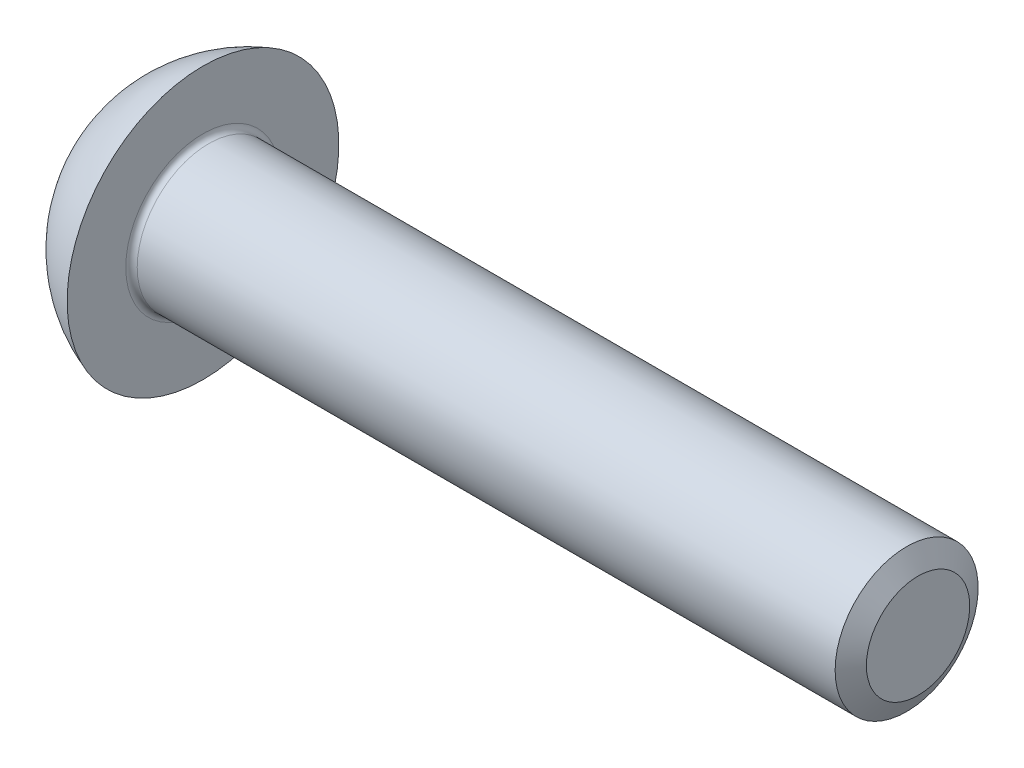
ISO-10303-21;
HEADER;
FILE_DESCRIPTION(('STEP AP214'),'2;1');
FILE_NAME('part.step','',(''),(''),'','','');
FILE_SCHEMA(('AUTOMOTIVE_DESIGN { 1 0 10303 214 1 1 1 1 }'));
ENDSEC;
DATA;
#1=APPLICATION_CONTEXT('core data for automotive mechanical design processes');
#2=APPLICATION_PROTOCOL_DEFINITION('international standard','automotive_design',2000,#1);
#3=PRODUCT_CONTEXT('',#1,'mechanical');
#4=PRODUCT('Part','Part','',(#3));
#5=PRODUCT_RELATED_PRODUCT_CATEGORY('part','',(#4));
#6=PRODUCT_DEFINITION_FORMATION('','',#4);
#7=PRODUCT_DEFINITION_CONTEXT('part definition',#1,'design');
#8=PRODUCT_DEFINITION('design','',#6,#7);
#9=PRODUCT_DEFINITION_SHAPE('','',#8);
#10=(LENGTH_UNIT() NAMED_UNIT(*) SI_UNIT(.MILLI.,.METRE.));
#11=(NAMED_UNIT(*) PLANE_ANGLE_UNIT() SI_UNIT($,.RADIAN.));
#12=(NAMED_UNIT(*) SI_UNIT($,.STERADIAN.) SOLID_ANGLE_UNIT());
#13=UNCERTAINTY_MEASURE_WITH_UNIT(LENGTH_MEASURE(1.E-05),#10,'distance_accuracy_value','');
#14=(GEOMETRIC_REPRESENTATION_CONTEXT(3) GLOBAL_UNCERTAINTY_ASSIGNED_CONTEXT((#13)) GLOBAL_UNIT_ASSIGNED_CONTEXT((#10,
#11,#12)) REPRESENTATION_CONTEXT('',''));
#15=CARTESIAN_POINT('',(0.,0.,0.));
#16=DIRECTION('',(0.,0.,1.));
#17=DIRECTION('',(1.,0.,0.));
#18=AXIS2_PLACEMENT_3D('',#15,#16,#17);
#19=CARTESIAN_POINT('',(-27.75,0.,0.));
#20=DIRECTION('',(-1.,0.,0.));
#21=DIRECTION('',(0.,0.,1.));
#22=AXIS2_PLACEMENT_3D('',#19,#20,#21);
#23=CYLINDRICAL_SURFACE('',#22,2.5);
#24=CARTESIAN_POINT('',(-24.8,0.,0.));
#25=DIRECTION('',(-1.,0.,0.));
#26=DIRECTION('',(0.,0.,1.));
#27=AXIS2_PLACEMENT_3D('',#24,#25,#26);
#28=CIRCLE('',#27,2.5);
#29=CARTESIAN_POINT('',(-24.8,0.,2.5));
#30=VERTEX_POINT('',#29);
#31=EDGE_CURVE('E258',#30,#30,#28,.T.);
#32=ORIENTED_EDGE('',*,*,#31,.F.);
#33=EDGE_LOOP('',(#32));
#34=FACE_BOUND('',#33,.T.);
#35=CARTESIAN_POINT('',(-0.4,0.,0.));
#36=DIRECTION('',(-1.,0.,0.));
#37=DIRECTION('',(0.,0.,1.));
#38=AXIS2_PLACEMENT_3D('',#35,#36,#37);
#39=CIRCLE('',#38,2.5);
#40=CARTESIAN_POINT('',(-0.4,0.,2.5));
#41=VERTEX_POINT('',#40);
#42=EDGE_CURVE('E445',#41,#41,#39,.T.);
#43=ORIENTED_EDGE('',*,*,#42,.T.);
#44=EDGE_LOOP('',(#43));
#45=FACE_BOUND('',#44,.T.);
#46=ADVANCED_FACE('F37',(#34,#45),#23,.T.);
#47=CARTESIAN_POINT('',(-27.75,0.,0.));
#48=DIRECTION('',(1.,0.,0.));
#49=DIRECTION('',(0.,0.,-1.));
#50=AXIS2_PLACEMENT_3D('',#47,#48,#49);
#51=PLANE('',#50);
#52=CARTESIAN_POINT('',(-27.75,0.,0.));
#53=DIRECTION('',(-1.,0.,0.));
#54=DIRECTION('',(0.,0.,1.));
#55=AXIS2_PLACEMENT_3D('',#52,#53,#54);
#56=CIRCLE('',#55,2.5);
#57=CARTESIAN_POINT('',(-27.75,2.50000000000001,0.));
#58=VERTEX_POINT('',#57);
#59=EDGE_CURVE('E250',#58,#58,#56,.T.);
#60=ORIENTED_EDGE('',*,*,#59,.T.);
#61=EDGE_LOOP('',(#60));
#62=FACE_BOUND('',#61,.T.);
#63=CARTESIAN_POINT('',(-27.75,0.,0.));
#64=DIRECTION('',(1.,0.,0.));
#65=DIRECTION('',(0.,0.,-1.));
#66=AXIS2_PLACEMENT_3D('',#63,#64,#65);
#67=CIRCLE('',#66,1.73205080756888);
#68=CARTESIAN_POINT('',(-27.75,-0.866025403784439,-1.5));
#69=VERTEX_POINT('',#68);
#70=CARTESIAN_POINT('',(-27.75,-1.73205080756888,0.));
#71=VERTEX_POINT('',#70);
#72=EDGE_CURVE('E11',#69,#71,#67,.F.);
#73=ORIENTED_EDGE('',*,*,#72,.F.);
#74=CARTESIAN_POINT('',(-27.75,0.866025403784439,-1.5));
#75=VERTEX_POINT('',#74);
#76=EDGE_CURVE('E41',#75,#69,#67,.F.);
#77=ORIENTED_EDGE('',*,*,#76,.F.);
#78=CARTESIAN_POINT('',(-27.75,1.73205080756888,0.));
#79=VERTEX_POINT('',#78);
#80=EDGE_CURVE('E110',#79,#75,#67,.F.);
#81=ORIENTED_EDGE('',*,*,#80,.F.);
#82=CARTESIAN_POINT('',(-27.75,0.866025403784438,1.5));
#83=VERTEX_POINT('',#82);
#84=EDGE_CURVE('E323',#83,#79,#67,.F.);
#85=ORIENTED_EDGE('',*,*,#84,.F.);
#86=CARTESIAN_POINT('',(-27.75,-0.866025403784439,1.5));
#87=VERTEX_POINT('',#86);
#88=EDGE_CURVE('E46',#87,#83,#67,.F.);
#89=ORIENTED_EDGE('',*,*,#88,.F.);
#90=CARTESIAN_POINT('',(-27.75,0.,0.));
#91=DIRECTION('',(-1.,0.,0.));
#92=DIRECTION('',(0.,-1.,0.));
#93=AXIS2_PLACEMENT_3D('',#90,#91,#92);
#94=CIRCLE('',#93,1.73205080756888);
#95=EDGE_CURVE('E113',#71,#87,#94,.T.);
#96=ORIENTED_EDGE('',*,*,#95,.F.);
#97=EDGE_LOOP('',(#73,#77,#81,#85,#89,#96));
#98=FACE_BOUND('',#97,.T.);
#99=ADVANCED_FACE('F39',(#62,#98),#51,.F.);
#100=CARTESIAN_POINT('',(-23.4090909090909,0.,0.));
#101=DIRECTION('',(-1.,0.,0.));
#102=DIRECTION('',(0.,1.,0.));
#103=AXIS2_PLACEMENT_3D('',#100,#101,#102);
#104=SPHERICAL_SURFACE('',#103,5.00934044915468);
#105=CARTESIAN_POINT('',(-25.,0.,0.));
#106=DIRECTION('',(-1.,0.,0.));
#107=DIRECTION('',(0.,0.,1.));
#108=AXIS2_PLACEMENT_3D('',#105,#106,#107);
#109=CIRCLE('',#108,4.75);
#110=CARTESIAN_POINT('',(-25.,4.75,0.));
#111=VERTEX_POINT('',#110);
#112=EDGE_CURVE('E253',#111,#111,#109,.T.);
#113=CARTESIAN_POINT('',(-27.75,2.50000000000001,0.));
#114=CARTESIAN_POINT('',(-27.7311175552492,2.53278694875914,0.));
#115=CARTESIAN_POINT('',(-27.7118635180392,2.56535988781073,0.));
#116=CARTESIAN_POINT('',(-27.6726224406993,2.63006120326841,0.));
#117=CARTESIAN_POINT('',(-27.6526354005692,2.66218957967448,0.));
#118=CARTESIAN_POINT('',(-27.6119384993871,2.72598522661067,0.));
#119=CARTESIAN_POINT('',(-27.591228638335,2.75765249714078,0.));
#120=CARTESIAN_POINT('',(-27.5490967492469,2.82050968698786,0.));
#121=CARTESIAN_POINT('',(-27.5276747212109,2.85169960630483,0.));
#122=CARTESIAN_POINT('',(-27.4841294907069,2.9135860770778,0.));
#123=CARTESIAN_POINT('',(-27.4620062882389,2.94428262853379,0.));
#124=CARTESIAN_POINT('',(-27.4170700686518,3.00516660462735,0.));
#125=CARTESIAN_POINT('',(-27.3942570515327,3.03535402926492,0.));
#126=CARTESIAN_POINT('',(-27.3479529146413,3.09520425297794,0.));
#127=CARTESIAN_POINT('',(-27.3244617948691,3.12486705205339,0.));
#128=CARTESIAN_POINT('',(-27.2768135133334,3.1836527955612,0.));
#129=CARTESIAN_POINT('',(-27.2526563515699,3.21277573999357,0.));
#130=CARTESIAN_POINT('',(-27.2036883885261,3.27046682221599,0.));
#131=CARTESIAN_POINT('',(-27.1788775872458,3.29903496000605,0.));
#132=CARTESIAN_POINT('',(-27.1286150832646,3.35560176181,0.));
#133=CARTESIAN_POINT('',(-27.1031633805637,3.38360042582389,0.));
#134=CARTESIAN_POINT('',(-27.0516321408722,3.43901390530852,0.));
#135=CARTESIAN_POINT('',(-27.0255526038815,3.46642872077927,0.));
#136=CARTESIAN_POINT('',(-26.9727790850795,3.52066042816535,0.));
#137=CARTESIAN_POINT('',(-26.9460851032681,3.54747732008068,0.));
#138=CARTESIAN_POINT('',(-26.8920963997549,3.60049941232258,0.));
#139=CARTESIAN_POINT('',(-26.8648016780529,3.62670461264913,0.));
#140=CARTESIAN_POINT('',(-26.8096255081138,3.67848986772817,0.));
#141=CARTESIAN_POINT('',(-26.7817440598766,3.70406992248065,0.));
#142=CARTESIAN_POINT('',(-26.7254087514531,3.75459175338155,0.));
#143=CARTESIAN_POINT('',(-26.6969548912667,3.77953352952998,0.));
#144=CARTESIAN_POINT('',(-26.6394893674124,3.82876599789079,0.));
#145=CARTESIAN_POINT('',(-26.6104777037444,3.85305669010317,0.));
#146=CARTESIAN_POINT('',(-26.5519114677755,3.90097451953224,0.));
#147=CARTESIAN_POINT('',(-26.5223568954747,3.92460165674892,0.));
#148=CARTESIAN_POINT('',(-26.4627200158231,3.97118024580204,0.));
#149=CARTESIAN_POINT('',(-26.4326377084724,3.99413169763847,0.));
#150=CARTESIAN_POINT('',(-26.371960803248,4.03934713244946,0.));
#151=CARTESIAN_POINT('',(-26.3413662053744,4.06161111542403,0.));
#152=CARTESIAN_POINT('',(-26.2796804266456,4.10544018198238,0.));
#153=CARTESIAN_POINT('',(-26.2485892457905,4.12700526556617,0.));
#154=CARTESIAN_POINT('',(-26.1859262635903,4.16942546163525,0.));
#155=CARTESIAN_POINT('',(-26.1543544622453,4.19028057412053,0.));
#156=CARTESIAN_POINT('',(-26.0907464483121,4.2312701207906,0.));
#157=CARTESIAN_POINT('',(-26.0587102357238,4.25140455497539,0.));
#158=CARTESIAN_POINT('',(-25.9941898469831,4.29094240784443,0.));
#159=CARTESIAN_POINT('',(-25.9617056708307,4.31034582652867,0.));
#160=CARTESIAN_POINT('',(-25.8963060326305,4.34841168650943,0.));
#161=CARTESIAN_POINT('',(-25.8633905705828,4.36707412780594,0.));
#162=CARTESIAN_POINT('',(-25.7971452596828,4.4036484515375,0.));
#163=CARTESIAN_POINT('',(-25.7638154108306,4.42156033397254,0.));
#164=CARTESIAN_POINT('',(-25.6967584381773,4.45662434389216,0.));
#165=CARTESIAN_POINT('',(-25.6630313143761,4.47377647137673,0.));
#166=CARTESIAN_POINT('',(-25.5951971075898,4.50731216521815,0.));
#167=CARTESIAN_POINT('',(-25.5610900246047,4.52369573157501,0.));
#168=CARTESIAN_POINT('',(-25.4925134104957,4.55568589214188,0.));
#169=CARTESIAN_POINT('',(-25.4580438793719,4.5712924863519,0.));
#170=CARTESIAN_POINT('',(-25.3887600653461,4.60172068837599,0.));
#171=CARTESIAN_POINT('',(-25.3539457824442,4.61654229619007,0.));
#172=CARTESIAN_POINT('',(-25.2839903410915,4.64539292215818,0.));
#173=CARTESIAN_POINT('',(-25.2488491826407,4.65942194031221,0.));
#174=CARTESIAN_POINT('',(-25.1782580235286,4.68668016088954,0.));
#175=CARTESIAN_POINT('',(-25.1428080228672,4.69990936331284,0.));
#176=CARTESIAN_POINT('',(-25.0716174112126,4.72556124794158,0.));
#177=CARTESIAN_POINT('',(-25.0358768002195,4.73798393014703,0.));
#178=CARTESIAN_POINT('',(-25.,4.75,0.));
#179=B_SPLINE_CURVE_WITH_KNOTS('',3,(#113,#114,#115,#116,#117,#118,#119,#120,#121,#122,#123,
#124,#125,#126,#127,#128,#129,#130,#131,#132,#133,#134,#135,#136,#137,#138,#139,#140,#141,#142,
#143,#144,#145,#146,#147,#148,#149,#150,#151,#152,#153,#154,#155,#156,#157,#158,#159,#160,#161,
#162,#163,#164,#165,#166,#167,#168,#169,#170,#171,#172,#173,#174,#175,#176,#177,#178),
.UNSPECIFIED.,.F.,.F.,(4,2,2,2,2,2,2,2,2,2,2,2,2,2,2,2,2,2,2,2,2,2,2,2,2,2,2,2,2,2,2,2,4),(0.,
0.113504291292348,0.227008582584698,0.340512873877048,0.454017165169397,0.567521456461745,
0.681025747754093,0.794530039046444,0.908034330338791,1.02153862163114,1.13504291292349,
1.24854720421584,1.36205149550819,1.47555578680054,1.58906007809289,1.70256436938524,
1.81606866067759,1.92957295196994,2.04307724326228,2.15658153455463,2.27008582584698,
2.38359011713933,2.49709440843168,2.61059869972403,2.72410299101638,2.83760728230873,
2.95111157360107,3.06461586489343,3.17812015618577,3.29162444747812,3.40512873877047,
3.51863303006282,3.63213732135517),.UNSPECIFIED.);
#180=EDGE_CURVE('BSEAM239',#58,#111,#179,.T.);
#181=ORIENTED_EDGE('',*,*,#59,.F.);
#182=ORIENTED_EDGE('',*,*,#112,.T.);
#183=ORIENTED_EDGE('',*,*,#180,.T.);
#184=ORIENTED_EDGE('',*,*,#180,.F.);
#185=EDGE_LOOP('',(#181,#183,#182,#184));
#186=FACE_BOUND('',#185,.T.);
#187=ADVANCED_FACE('F239',(#186),#104,.T.);
#188=CARTESIAN_POINT('',(-25.,2.7,0.));
#189=DIRECTION('',(-1.,0.,0.));
#190=DIRECTION('',(0.,0.,1.));
#191=AXIS2_PLACEMENT_3D('',#188,#189,#190);
#192=PLANE('',#191);
#193=ORIENTED_EDGE('',*,*,#112,.F.);
#194=EDGE_LOOP('',(#193));
#195=FACE_BOUND('',#194,.T.);
#196=CARTESIAN_POINT('',(-25.,0.,0.));
#197=DIRECTION('',(-1.,0.,0.));
#198=DIRECTION('',(0.,0.,1.));
#199=AXIS2_PLACEMENT_3D('',#196,#197,#198);
#200=CIRCLE('',#199,2.7);
#201=CARTESIAN_POINT('',(-25.,0.,2.7));
#202=VERTEX_POINT('',#201);
#203=EDGE_CURVE('E254',#202,#202,#200,.T.);
#204=ORIENTED_EDGE('',*,*,#203,.T.);
#205=EDGE_LOOP('',(#204));
#206=FACE_BOUND('',#205,.T.);
#207=ADVANCED_FACE('F236',(#195,#206),#192,.F.);
#208=CARTESIAN_POINT('',(-24.8,0.,0.));
#209=DIRECTION('',(-1.,0.,0.));
#210=DIRECTION('',(0.,0.,1.));
#211=AXIS2_PLACEMENT_3D('',#208,#209,#210);
#212=TOROIDAL_SURFACE('',#211,2.7,0.199999999999999);
#213=ORIENTED_EDGE('',*,*,#203,.F.);
#214=EDGE_LOOP('',(#213));
#215=FACE_BOUND('',#214,.T.);
#216=ORIENTED_EDGE('',*,*,#31,.T.);
#217=EDGE_LOOP('',(#216));
#218=FACE_BOUND('',#217,.T.);
#219=ADVANCED_FACE('F233',(#215,#218),#212,.F.);
#220=CARTESIAN_POINT('',(-27.31,0.,0.));
#221=DIRECTION('',(-1.,0.,0.));
#222=DIRECTION('',(0.,-1.,0.));
#223=AXIS2_PLACEMENT_3D('',#220,#221,#222);
#224=CONICAL_SURFACE('',#223,0.,1.32202446504011);
#225=CARTESIAN_POINT('',(-27.9997327986404,-2.26315484172187,-1.5));
#226=CARTESIAN_POINT('',(-27.9853857350657,-2.19538826304415,-1.5));
#227=CARTESIAN_POINT('',(-27.9712220195062,-2.12758283804671,-1.5));
#228=CARTESIAN_POINT('',(-27.9433537036584,-1.99187493960313,-1.5));
#229=CARTESIAN_POINT('',(-27.9296491220636,-1.92397246232262,-1.5));
#230=CARTESIAN_POINT('',(-27.8893400794674,-1.71997534200334,-1.5));
#231=CARTESIAN_POINT('',(-27.8635667005034,-1.58371395303,-1.5));
#232=CARTESIAN_POINT('',(-27.8155779533991,-1.3116391722774,-1.5));
#233=CARTESIAN_POINT('',(-27.793336642225,-1.17583044881344,-1.5));
#234=CARTESIAN_POINT('',(-27.7539239714673,-0.903481186888281,-1.5));
#235=CARTESIAN_POINT('',(-27.7367516962328,-0.766940785137059,-1.5));
#236=CARTESIAN_POINT('',(-27.709706129123,-0.491701196322738,-1.5));
#237=CARTESIAN_POINT('',(-27.6999076664801,-0.352994084625562,-1.5));
#238=CARTESIAN_POINT('',(-27.6924178089428,-0.144706433475353,-1.5));
#239=CARTESIAN_POINT('',(-27.6911221806896,-0.0752488922868261,-1.5));
#240=CARTESIAN_POINT('',(-27.6909858523406,0.0636686770369293,-1.5));
#241=CARTESIAN_POINT('',(-27.6921451546032,0.133128705174483,-1.5));
#242=CARTESIAN_POINT('',(-27.6992549405331,0.341881937640923,-1.5));
#243=CARTESIAN_POINT('',(-27.7088546722717,0.481057921169192,-1.5));
#244=CARTESIAN_POINT('',(-27.7357583960435,0.758693846093777,-1.5));
#245=CARTESIAN_POINT('',(-27.7530672903777,0.897153275062592,-1.5));
#246=CARTESIAN_POINT('',(-27.7932968062946,1.17595805857205,-1.5));
#247=CARTESIAN_POINT('',(-27.8163192995754,1.31628822780093,-1.5));
#248=CARTESIAN_POINT('',(-27.8658765091574,1.59633374824372,-1.5));
#249=CARTESIAN_POINT('',(-27.8924117291953,1.73604900830286,-1.5));
#250=CARTESIAN_POINT('',(-27.9477673387906,2.01506024311157,-1.5));
#251=CARTESIAN_POINT('',(-27.9765883427125,2.15435609462068,-1.5));
#252=CARTESIAN_POINT('',(-28.0357503424025,2.43262525968748,-1.5));
#253=CARTESIAN_POINT('',(-28.0660913684414,2.57159856676409,-1.5));
#254=CARTESIAN_POINT('',(-28.1274868354949,2.84781730595657,-1.5));
#255=CARTESIAN_POINT('',(-28.1585300832572,2.9850652362243,-1.5));
#256=CARTESIAN_POINT('',(-28.2213470846916,3.25939633410717,-1.5));
#257=CARTESIAN_POINT('',(-28.2531208531965,3.3964794983173,-1.5));
#258=CARTESIAN_POINT('',(-28.3171602523357,3.67034628769396,-1.5));
#259=CARTESIAN_POINT('',(-28.3494252041408,3.80713007192237,-1.5));
#260=CARTESIAN_POINT('',(-28.4143613419051,4.08059651515644,-1.5));
#261=CARTESIAN_POINT('',(-28.4470325145344,4.2172791773253,-1.5));
#262=CARTESIAN_POINT('',(-28.4798452974435,4.35392744466994,-1.5));
#263=B_SPLINE_CURVE_WITH_KNOTS('',3,(#225,#226,#227,#228,#229,#230,#231,#232,#233,#234,#235,
#236,#237,#238,#239,#240,#241,#242,#243,#244,#245,#246,#247,#248,#249,#250,#251,#252,#253,#254,
#255,#256,#257,#258,#259,#260,#261,#262),.UNSPECIFIED.,.F.,.F.,(4,2,2,2,2,2,2,2,2,2,2,2,2,2,2,2,
2,2,4),(0.,0.207805451429303,0.415619353325522,0.831624344388975,1.24441629689243,
1.65713363858961,2.07398475112846,2.2823533704914,2.49072219003519,2.90892839515078,
3.32740092054575,3.75395104515456,4.18056240487916,4.60728881874959,5.03402373410526,
5.45616570257761,5.87831624988613,6.2999285163862,6.7215269840495),.UNSPECIFIED.);
#264=EDGE_CURVE('E101',#69,#75,#263,.T.);
#265=ORIENTED_EDGE('',*,*,#264,.T.);
#266=ORIENTED_EDGE('',*,*,#76,.T.);
#267=EDGE_LOOP('',(#265,#266));
#268=FACE_BOUND('',#267,.T.);
#269=ADVANCED_FACE('F105',(#268),#224,.F.);
#270=CARTESIAN_POINT('',(-27.7500293362665,0.865909933730601,-1.5002));
#271=CARTESIAN_POINT('',(-27.74088246153,0.901895428599615,-1.43787129455136));
#272=CARTESIAN_POINT('',(-27.7325805371761,0.937939683086652,-1.37544081445887));
#273=CARTESIAN_POINT('',(-27.7179971360444,1.01014267536443,-1.25038156337525));
#274=CARTESIAN_POINT('',(-27.7117163935223,1.04630144995174,-1.18775272865061));
#275=CARTESIAN_POINT('',(-27.7015367196182,1.11853617159982,-1.06263852068553));
#276=CARTESIAN_POINT('',(-27.6976268615435,1.15461172337414,-1.00015383210133));
#277=CARTESIAN_POINT('',(-27.6923843134507,1.22680422415262,-0.875112752827542));
#278=CARTESIAN_POINT('',(-27.6910511776652,1.26292116491464,-0.812556376413771));
#279=CARTESIAN_POINT('',(-27.6910511776652,1.33515504643868,-0.687443623586229));
#280=CARTESIAN_POINT('',(-27.6923843134507,1.37127198720069,-0.624887247172458));
#281=CARTESIAN_POINT('',(-27.6976268615435,1.44346448797918,-0.499846167898673));
#282=CARTESIAN_POINT('',(-27.7015367196182,1.47954003975349,-0.437361479314471));
#283=CARTESIAN_POINT('',(-27.7117163935223,1.55177476140158,-0.312247271349392));
#284=CARTESIAN_POINT('',(-27.7179971360444,1.58793353598888,-0.249618436624751));
#285=CARTESIAN_POINT('',(-27.7325805371761,1.66013652826666,-0.124559185541131));
#286=CARTESIAN_POINT('',(-27.74088246153,1.6961807827537,-0.0621287054486417));
#287=CARTESIAN_POINT('',(-27.7500293362665,1.73216627762272,0.000199999999999961));
#288=B_SPLINE_CURVE_WITH_KNOTS('',3,(#270,#271,#272,#273,#274,#275,#276,#277,#278,#279,#280,
#281,#282,#283,#284,#285,#286,#287),.UNSPECIFIED.,.F.,.F.,(4,2,2,2,2,2,2,2,4),(0.,
0.217659888175594,0.435398758882079,0.652126354970008,0.868816454295957,1.08550655362191,
1.30223414970984,1.51997302041632,1.73763290859191),.UNSPECIFIED.);
#289=EDGE_CURVE('E129',#75,#79,#288,.T.);
#290=ORIENTED_EDGE('',*,*,#289,.T.);
#291=ORIENTED_EDGE('',*,*,#80,.T.);
#292=EDGE_LOOP('',(#290,#291));
#293=FACE_BOUND('',#292,.T.);
#294=ADVANCED_FACE('F157',(#293),#224,.F.);
#295=CARTESIAN_POINT('',(-27.7500293362665,1.73216627762271,-0.000200000000000225));
#296=CARTESIAN_POINT('',(-27.74088246153,1.6961807827537,0.0621287054486414));
#297=CARTESIAN_POINT('',(-27.7325805371761,1.66013652826666,0.124559185541131));
#298=CARTESIAN_POINT('',(-27.7179971360444,1.58793353598888,0.249618436624751));
#299=CARTESIAN_POINT('',(-27.7117163935223,1.55177476140158,0.312247271349392));
#300=CARTESIAN_POINT('',(-27.7015367196182,1.47954003975349,0.437361479314471));
#301=CARTESIAN_POINT('',(-27.6976268615435,1.44346448797918,0.499846167898673));
#302=CARTESIAN_POINT('',(-27.6923843134507,1.37127198720069,0.624887247172458));
#303=CARTESIAN_POINT('',(-27.6910511776652,1.33515504643868,0.687443623586229));
#304=CARTESIAN_POINT('',(-27.6910511776652,1.26292116491464,0.812556376413771));
#305=CARTESIAN_POINT('',(-27.6923843134507,1.22680422415262,0.875112752827542));
#306=CARTESIAN_POINT('',(-27.6976268615435,1.15461172337414,1.00015383210133));
#307=CARTESIAN_POINT('',(-27.7015367196182,1.11853617159982,1.06263852068553));
#308=CARTESIAN_POINT('',(-27.7117163935223,1.04630144995174,1.18775272865061));
#309=CARTESIAN_POINT('',(-27.7179971360444,1.01014267536443,1.25038156337525));
#310=CARTESIAN_POINT('',(-27.7325805371761,0.937939683086651,1.37544081445887));
#311=CARTESIAN_POINT('',(-27.74088246153,0.901895428599615,1.43787129455136));
#312=CARTESIAN_POINT('',(-27.7500293362665,0.865909933730601,1.5002));
#313=B_SPLINE_CURVE_WITH_KNOTS('',3,(#295,#296,#297,#298,#299,#300,#301,#302,#303,#304,#305,
#306,#307,#308,#309,#310,#311,#312),.UNSPECIFIED.,.F.,.F.,(4,2,2,2,2,2,2,2,4),(0.,
0.217659888175594,0.435398758882079,0.652126354970008,0.868816454295957,1.08550655362191,
1.30223414970984,1.51997302041632,1.73763290859191),.UNSPECIFIED.);
#314=EDGE_CURVE('E179',#79,#83,#313,.T.);
#315=ORIENTED_EDGE('',*,*,#314,.T.);
#316=ORIENTED_EDGE('',*,*,#84,.T.);
#317=EDGE_LOOP('',(#315,#316));
#318=FACE_BOUND('',#317,.T.);
#319=ADVANCED_FACE('F151',(#318),#224,.F.);
#320=CARTESIAN_POINT('',(-27.9997327986404,-2.26315484172187,1.5));
#321=CARTESIAN_POINT('',(-27.9853857350657,-2.19538826304415,1.5));
#322=CARTESIAN_POINT('',(-27.9712220195062,-2.12758283804671,1.5));
#323=CARTESIAN_POINT('',(-27.9433537036584,-1.99187493960313,1.5));
#324=CARTESIAN_POINT('',(-27.9296491220636,-1.92397246232262,1.5));
#325=CARTESIAN_POINT('',(-27.8893400794674,-1.71997534200334,1.5));
#326=CARTESIAN_POINT('',(-27.8635667005034,-1.58371395303,1.5));
#327=CARTESIAN_POINT('',(-27.8155779533991,-1.3116391722774,1.5));
#328=CARTESIAN_POINT('',(-27.793336642225,-1.17583044881344,1.5));
#329=CARTESIAN_POINT('',(-27.7539239714673,-0.903481186888281,1.5));
#330=CARTESIAN_POINT('',(-27.7367516962328,-0.766940785137059,1.5));
#331=CARTESIAN_POINT('',(-27.709706129123,-0.491701196322739,1.5));
#332=CARTESIAN_POINT('',(-27.6999076664801,-0.352994084625562,1.5));
#333=CARTESIAN_POINT('',(-27.6924178089428,-0.144706433475353,1.5));
#334=CARTESIAN_POINT('',(-27.6911221806896,-0.0752488922868266,1.5));
#335=CARTESIAN_POINT('',(-27.6909858523406,0.0636686770369288,1.5));
#336=CARTESIAN_POINT('',(-27.6921451546032,0.133128705174483,1.5));
#337=CARTESIAN_POINT('',(-27.6992549405331,0.341881937640923,1.5));
#338=CARTESIAN_POINT('',(-27.7088546722717,0.481057921169192,1.5));
#339=CARTESIAN_POINT('',(-27.7357583960435,0.758693846093777,1.5));
#340=CARTESIAN_POINT('',(-27.7530672903777,0.897153275062592,1.5));
#341=CARTESIAN_POINT('',(-27.7932968062946,1.17595805857205,1.5));
#342=CARTESIAN_POINT('',(-27.8163192995754,1.31628822780093,1.5));
#343=CARTESIAN_POINT('',(-27.8658765091574,1.59633374824372,1.5));
#344=CARTESIAN_POINT('',(-27.8924117291953,1.73604900830286,1.5));
#345=CARTESIAN_POINT('',(-27.9477673387906,2.01506024311157,1.5));
#346=CARTESIAN_POINT('',(-27.9765883427125,2.15435609462068,1.5));
#347=CARTESIAN_POINT('',(-28.0357503424025,2.43262525968748,1.5));
#348=CARTESIAN_POINT('',(-28.0660913684414,2.57159856676409,1.5));
#349=CARTESIAN_POINT('',(-28.1274868354949,2.84781730595657,1.5));
#350=CARTESIAN_POINT('',(-28.1585300832572,2.9850652362243,1.5));
#351=CARTESIAN_POINT('',(-28.2213470846916,3.25939633410717,1.5));
#352=CARTESIAN_POINT('',(-28.2531208531965,3.3964794983173,1.5));
#353=CARTESIAN_POINT('',(-28.3171602523357,3.67034628769396,1.5));
#354=CARTESIAN_POINT('',(-28.3494252041408,3.80713007192237,1.5));
#355=CARTESIAN_POINT('',(-28.4143613419051,4.08059651515644,1.5));
#356=CARTESIAN_POINT('',(-28.4470325145344,4.2172791773253,1.5));
#357=CARTESIAN_POINT('',(-28.4798452974435,4.35392744466994,1.5));
#358=B_SPLINE_CURVE_WITH_KNOTS('',3,(#320,#321,#322,#323,#324,#325,#326,#327,#328,#329,#330,
#331,#332,#333,#334,#335,#336,#337,#338,#339,#340,#341,#342,#343,#344,#345,#346,#347,#348,#349,
#350,#351,#352,#353,#354,#355,#356,#357),.UNSPECIFIED.,.F.,.F.,(4,2,2,2,2,2,2,2,2,2,2,2,2,2,2,2,
2,2,4),(0.,0.207805451429303,0.415619353325523,0.831624344388975,1.24441629689243,
1.65713363858961,2.07398475112846,2.2823533704914,2.49072219003519,2.90892839515078,
3.32740092054575,3.75395104515456,4.18056240487916,4.60728881874959,5.03402373410526,
5.45616570257761,5.87831624988613,6.2999285163862,6.7215269840495),.UNSPECIFIED.);
#359=EDGE_CURVE('E58',#83,#87,#358,.F.);
#360=ORIENTED_EDGE('',*,*,#359,.T.);
#361=ORIENTED_EDGE('',*,*,#88,.T.);
#362=EDGE_LOOP('',(#360,#361));
#363=FACE_BOUND('',#362,.T.);
#364=ADVANCED_FACE('F156',(#363),#224,.F.);
#365=CARTESIAN_POINT('',(-27.7500293362665,-0.865909933730602,1.5002));
#366=CARTESIAN_POINT('',(-27.74088246153,-0.901895428599616,1.43787129455136));
#367=CARTESIAN_POINT('',(-27.7325805371761,-0.937939683086652,1.37544081445887));
#368=CARTESIAN_POINT('',(-27.7179971360444,-1.01014267536443,1.25038156337525));
#369=CARTESIAN_POINT('',(-27.7117163935223,-1.04630144995174,1.18775272865061));
#370=CARTESIAN_POINT('',(-27.7015367196182,-1.11853617159982,1.06263852068553));
#371=CARTESIAN_POINT('',(-27.6976268615435,-1.15461172337414,1.00015383210133));
#372=CARTESIAN_POINT('',(-27.6923843134507,-1.22680422415262,0.875112752827542));
#373=CARTESIAN_POINT('',(-27.6910511776652,-1.26292116491464,0.812556376413771));
#374=CARTESIAN_POINT('',(-27.6910511776652,-1.33515504643868,0.687443623586229));
#375=CARTESIAN_POINT('',(-27.6923843134507,-1.3712719872007,0.624887247172458));
#376=CARTESIAN_POINT('',(-27.6976268615435,-1.44346448797918,0.499846167898673));
#377=CARTESIAN_POINT('',(-27.7015367196182,-1.4795400397535,0.437361479314471));
#378=CARTESIAN_POINT('',(-27.7117163935223,-1.55177476140158,0.312247271349392));
#379=CARTESIAN_POINT('',(-27.7179971360444,-1.58793353598888,0.249618436624751));
#380=CARTESIAN_POINT('',(-27.7325805371761,-1.66013652826667,0.124559185541131));
#381=CARTESIAN_POINT('',(-27.74088246153,-1.6961807827537,0.0621287054486417));
#382=CARTESIAN_POINT('',(-27.7500293362665,-1.73216627762272,-0.000200000000000103));
#383=B_SPLINE_CURVE_WITH_KNOTS('',3,(#365,#366,#367,#368,#369,#370,#371,#372,#373,#374,#375,
#376,#377,#378,#379,#380,#381,#382),.UNSPECIFIED.,.F.,.F.,(4,2,2,2,2,2,2,2,4),(0.,
0.217659888175594,0.435398758882078,0.652126354970008,0.868816454295957,1.08550655362191,
1.30223414970984,1.51997302041632,1.73763290859191),.UNSPECIFIED.);
#384=EDGE_CURVE('E52',#87,#71,#383,.T.);
#385=ORIENTED_EDGE('',*,*,#384,.T.);
#386=ORIENTED_EDGE('',*,*,#95,.T.);
#387=EDGE_LOOP('',(#385,#386));
#388=FACE_BOUND('',#387,.T.);
#389=ADVANCED_FACE('F310',(#388),#224,.F.);
#390=CARTESIAN_POINT('',(-27.7500293362665,-1.73216627762272,0.00019999999999925));
#391=CARTESIAN_POINT('',(-27.74088246153,-1.6961807827537,-0.0621287054486427));
#392=CARTESIAN_POINT('',(-27.7325805371761,-1.66013652826667,-0.124559185541132));
#393=CARTESIAN_POINT('',(-27.7179971360444,-1.58793353598888,-0.249618436624752));
#394=CARTESIAN_POINT('',(-27.7117163935223,-1.55177476140158,-0.312247271349392));
#395=CARTESIAN_POINT('',(-27.7015367196182,-1.4795400397535,-0.437361479314472));
#396=CARTESIAN_POINT('',(-27.6976268615435,-1.44346448797918,-0.499846167898674));
#397=CARTESIAN_POINT('',(-27.6923843134507,-1.3712719872007,-0.624887247172459));
#398=CARTESIAN_POINT('',(-27.6910511776652,-1.33515504643868,-0.687443623586229));
#399=CARTESIAN_POINT('',(-27.6910511776652,-1.26292116491464,-0.812556376413771));
#400=CARTESIAN_POINT('',(-27.6923843134507,-1.22680422415262,-0.875112752827542));
#401=CARTESIAN_POINT('',(-27.6976268615435,-1.15461172337414,-1.00015383210133));
#402=CARTESIAN_POINT('',(-27.7015367196182,-1.11853617159982,-1.06263852068553));
#403=CARTESIAN_POINT('',(-27.7117163935223,-1.04630144995174,-1.18775272865061));
#404=CARTESIAN_POINT('',(-27.7179971360444,-1.01014267536443,-1.25038156337525));
#405=CARTESIAN_POINT('',(-27.7325805371761,-0.937939683086652,-1.37544081445887));
#406=CARTESIAN_POINT('',(-27.74088246153,-0.901895428599616,-1.43787129455136));
#407=CARTESIAN_POINT('',(-27.7500293362665,-0.865909933730602,-1.5002));
#408=B_SPLINE_CURVE_WITH_KNOTS('',3,(#390,#391,#392,#393,#394,#395,#396,#397,#398,#399,#400,
#401,#402,#403,#404,#405,#406,#407),.UNSPECIFIED.,.F.,.F.,(4,2,2,2,2,2,2,2,4),(0.,
0.217659888175594,0.435398758882078,0.652126354970008,0.868816454295957,1.08550655362191,
1.30223414970983,1.51997302041632,1.73763290859191),.UNSPECIFIED.);
#409=EDGE_CURVE('E93',#71,#69,#408,.T.);
#410=ORIENTED_EDGE('',*,*,#409,.T.);
#411=ORIENTED_EDGE('',*,*,#72,.T.);
#412=EDGE_LOOP('',(#410,#411));
#413=FACE_BOUND('',#412,.T.);
#414=ADVANCED_FACE('F95',(#413),#224,.F.);
#415=CARTESIAN_POINT('',(-26.19,0.,0.));
#416=DIRECTION('',(-1.,0.,0.));
#417=DIRECTION('',(0.,0.,1.));
#418=AXIS2_PLACEMENT_3D('',#415,#416,#417);
#419=CONICAL_SURFACE('',#418,1.73205080756888,0.9688167751957);
#420=CARTESIAN_POINT('',(-25.,0.,0.));
#421=VERTEX_POINT('',#420);
#422=VERTEX_LOOP('',#421);
#423=FACE_BOUND('',#422,.T.);
#424=CARTESIAN_POINT('',(-26.7143652871569,-1.99408064313991,1.5));
#425=CARTESIAN_POINT('',(-26.684227855331,-1.93917647330948,1.5));
#426=CARTESIAN_POINT('',(-26.6544233144778,-1.88408663074089,1.5));
#427=CARTESIAN_POINT('',(-26.5956475088077,-1.77344983083036,1.5));
#428=CARTESIAN_POINT('',(-26.5666764212646,-1.71790277942533,1.5));
#429=CARTESIAN_POINT('',(-26.509567028683,-1.60593431975272,1.5));
#430=CARTESIAN_POINT('',(-26.4814351847783,-1.54950959844382,1.5));
#431=CARTESIAN_POINT('',(-26.4264488202439,-1.43604611919069,1.5));
#432=CARTESIAN_POINT('',(-26.399594226521,-1.37900739661351,1.5));
#433=CARTESIAN_POINT('',(-26.3197775837943,-1.2033156155846,1.5));
#434=CARTESIAN_POINT('',(-26.2693416399369,-1.08349045754164,1.5));
#435=CARTESIAN_POINT('',(-26.1790949619613,-0.8400581944788,1.5));
#436=CARTESIAN_POINT('',(-26.139256444983,-0.716461944664997,1.5));
#437=CARTESIAN_POINT('',(-26.0902439408571,-0.521743313216658,1.5));
#438=CARTESIAN_POINT('',(-26.0753421174822,-0.45207993269385,1.5));
#439=CARTESIAN_POINT('',(-26.0515518141555,-0.311717383105093,1.5));
#440=CARTESIAN_POINT('',(-26.0426622801891,-0.241018397812503,1.5));
#441=CARTESIAN_POINT('',(-26.0317604291188,-0.10011099678774,1.5));
#442=CARTESIAN_POINT('',(-26.0296501098018,-0.0299103680159297,1.5));
#443=CARTESIAN_POINT('',(-26.0322315011996,0.110369362468126,1.5));
#444=CARTESIAN_POINT('',(-26.0369241805432,0.180448445451887,1.5));
#445=CARTESIAN_POINT('',(-26.0544804827323,0.335771456747223,1.5));
#446=CARTESIAN_POINT('',(-26.0689629761538,0.420830424976738,1.5));
#447=CARTESIAN_POINT('',(-26.1058580296261,0.589196026048479,1.5));
#448=CARTESIAN_POINT('',(-26.1282753745263,0.672501569361891,1.5));
#449=CARTESIAN_POINT('',(-26.1797644805511,0.839227656420879,1.5));
#450=CARTESIAN_POINT('',(-26.208985606932,0.922601164698547,1.5));
#451=CARTESIAN_POINT('',(-26.2562928043733,1.04629218365326,1.5));
#452=CARTESIAN_POINT('',(-26.272640267702,1.0872924127348,1.5));
#453=CARTESIAN_POINT('',(-26.3063320836918,1.16888024651751,1.5));
#454=CARTESIAN_POINT('',(-26.3236763971299,1.20946786737972,1.5));
#455=CARTESIAN_POINT('',(-26.3779952738762,1.33298038355504,1.5));
#456=CARTESIAN_POINT('',(-26.4163386174147,1.41530297926866,1.5));
#457=CARTESIAN_POINT('',(-26.495635756582,1.57868674687711,1.5));
#458=CARTESIAN_POINT('',(-26.5365900776787,1.65974766074442,1.5));
#459=CARTESIAN_POINT('',(-26.6204609314907,1.82090931341637,1.5));
#460=CARTESIAN_POINT('',(-26.6633786931538,1.90100941012621,1.5));
#461=CARTESIAN_POINT('',(-26.7506848855457,2.06040592965211,1.5));
#462=CARTESIAN_POINT('',(-26.7950733934288,2.13970231002002,1.5));
#463=CARTESIAN_POINT('',(-26.930164519251,2.37707005979971,1.5));
#464=CARTESIAN_POINT('',(-27.0225574046205,2.53417780353515,1.5));
#465=CARTESIAN_POINT('',(-27.2100828976953,2.84665345203122,1.5));
#466=CARTESIAN_POINT('',(-27.3052144606998,3.00202198962762,1.5));
#467=CARTESIAN_POINT('',(-27.4847567141849,3.29134301760585,1.5));
#468=CARTESIAN_POINT('',(-27.5689406054582,3.42543652219581,1.5));
#469=CARTESIAN_POINT('',(-27.7383361071422,3.69299221027437,1.5));
#470=CARTESIAN_POINT('',(-27.8235478291718,3.82645432296446,1.5));
#471=CARTESIAN_POINT('',(-27.9942515824776,4.09214637193531,1.5));
#472=CARTESIAN_POINT('',(-28.0797393883462,4.22437902653419,1.5));
#473=CARTESIAN_POINT('',(-28.2512890449572,4.48844643440619,1.5));
#474=CARTESIAN_POINT('',(-28.337350817286,4.6202812385973,1.5));
#475=CARTESIAN_POINT('',(-28.4236230682157,4.75197710942023,1.5));
#476=B_SPLINE_CURVE_WITH_KNOTS('',3,(#424,#425,#426,#427,#428,#429,#430,#431,#432,#433,#434,
#435,#436,#437,#438,#439,#440,#441,#442,#443,#444,#445,#446,#447,#448,#449,#450,#451,#452,#453,
#454,#455,#456,#457,#458,#459,#460,#461,#462,#463,#464,#465,#466,#467,#468,#469,#470,#471,#472,
#473,#474,#475),.UNSPECIFIED.,.F.,.F.,(4,2,2,2,2,2,2,2,2,2,2,2,2,2,2,2,2,2,2,2,2,2,2,2,2,4),(0.,
0.187897672724946,0.375835019809246,0.564966516875882,0.754087177468065,1.14383628374048,
1.53255329837711,1.74605704440216,1.95952335136655,2.16988950807789,2.38028562021645,
2.63864645394486,2.89716334978482,3.16200405007931,3.29441189873303,3.42681454110392,
3.69918602540152,3.97161249945486,4.24421188688914,4.51682559737459,5.06355522456946,
5.61007898891364,6.08505893344604,6.5600909321466,7.03246913033172,7.50478406427736),.UNSPECIFIED.);
#477=CARTESIAN_POINT('',(-26.19,-0.86602540378444,1.5));
#478=VERTEX_POINT('',#477);
#479=CARTESIAN_POINT('',(-26.19,0.866025403784438,1.5));
#480=VERTEX_POINT('',#479);
#481=EDGE_CURVE('E195',#478,#480,#476,.T.);
#482=ORIENTED_EDGE('',*,*,#481,.T.);
#483=CARTESIAN_POINT('',(-26.1900793412661,0.865909933730601,1.5002));
#484=CARTESIAN_POINT('',(-26.1634691060163,0.904628108595007,1.43313815395851));
#485=CARTESIAN_POINT('',(-26.1392096198792,0.943819339495374,1.36525695082791));
#486=CARTESIAN_POINT('',(-26.0969184478749,1.02317811595439,1.2278035179744));
#487=CARTESIAN_POINT('',(-26.0789101024377,1.06334873364809,1.15822596715748));
#488=CARTESIAN_POINT('',(-26.051360884505,1.14298393177099,1.02029375793781));
#489=CARTESIAN_POINT('',(-26.041544608846,1.18242369147111,0.951982090298889));
#490=CARTESIAN_POINT('',(-26.0304461987689,1.2615373932253,0.814953139285775));
#491=CARTESIAN_POINT('',(-26.0291476300534,1.30121073639966,0.746236893201675));
#492=CARTESIAN_POINT('',(-26.034672374901,1.37365810646578,0.62075436737241));
#493=CARTESIAN_POINT('',(-26.0401544132113,1.40646009894811,0.563939649803516));
#494=CARTESIAN_POINT('',(-26.0566235391784,1.47175617463545,0.450843529178185));
#495=CARTESIAN_POINT('',(-26.0676180560889,1.50424978184483,0.394562950570361));
#496=CARTESIAN_POINT('',(-26.0947645558192,1.56971224903147,0.281178631414286));
#497=CARTESIAN_POINT('',(-26.1110632959916,1.6026654835586,0.224101954939563));
#498=CARTESIAN_POINT('',(-26.1477413089342,1.66790213243921,0.111108764562816));
#499=CARTESIAN_POINT('',(-26.1681087683375,1.70018719405561,0.0551893975177125));
#500=CARTESIAN_POINT('',(-26.1900793412661,1.73216627762271,-0.000200000000000001));
#501=B_SPLINE_CURVE_WITH_KNOTS('',3,(#483,#484,#485,#486,#487,#488,#489,#490,#491,#492,#493,
#494,#495,#496,#497,#498,#499,#500),.UNSPECIFIED.,.F.,.F.,(4,2,2,2,2,2,2,2,4),(0.,
0.245805375632315,0.49251890592962,0.730559729160707,0.968141134459948,1.16539297017392,
1.36291136273929,1.56644008251059,1.76938623584072),.UNSPECIFIED.);
#502=CARTESIAN_POINT('',(-26.19,1.73205080756888,0.));
#503=VERTEX_POINT('',#502);
#504=EDGE_CURVE('E203',#480,#503,#501,.T.);
#505=ORIENTED_EDGE('',*,*,#504,.T.);
#506=CARTESIAN_POINT('',(-26.1900793412661,1.73216627762271,0.000199999999999775));
#507=CARTESIAN_POINT('',(-26.1634691060163,1.69344810275831,-0.0668618460414889));
#508=CARTESIAN_POINT('',(-26.1392096198792,1.65425687185794,-0.134743049172087));
#509=CARTESIAN_POINT('',(-26.0969184478749,1.57489809539893,-0.272196482025596));
#510=CARTESIAN_POINT('',(-26.0789101024377,1.53472747770523,-0.341774032842517));
#511=CARTESIAN_POINT('',(-26.051360884505,1.45509227958233,-0.479706242062188));
#512=CARTESIAN_POINT('',(-26.041544608846,1.4156525198822,-0.548017909701111));
#513=CARTESIAN_POINT('',(-26.0304461987689,1.33653881812801,-0.685046860714225));
#514=CARTESIAN_POINT('',(-26.0291476300534,1.29686547495366,-0.753763106798325));
#515=CARTESIAN_POINT('',(-26.034672374901,1.22441810488754,-0.879245632627591));
#516=CARTESIAN_POINT('',(-26.0401544132113,1.1916161124052,-0.936060350196485));
#517=CARTESIAN_POINT('',(-26.0566235391784,1.12632003671786,-1.04915647082182));
#518=CARTESIAN_POINT('',(-26.0676180560889,1.09382642950849,-1.10543704942964));
#519=CARTESIAN_POINT('',(-26.0947645558192,1.02836396232185,-1.21882136858571));
#520=CARTESIAN_POINT('',(-26.1110632959916,0.995410727794717,-1.27589804506044));
#521=CARTESIAN_POINT('',(-26.1477413089342,0.930174078914108,-1.38889123543718));
#522=CARTESIAN_POINT('',(-26.1681087683375,0.897889017297704,-1.44481060248229));
#523=CARTESIAN_POINT('',(-26.1900793412661,0.865909933730601,-1.5002));
#524=B_SPLINE_CURVE_WITH_KNOTS('',3,(#506,#507,#508,#509,#510,#511,#512,#513,#514,#515,#516,
#517,#518,#519,#520,#521,#522,#523),.UNSPECIFIED.,.F.,.F.,(4,2,2,2,2,2,2,2,4),(0.,
0.245805375632315,0.492518905929621,0.730559729160707,0.968141134459949,1.16539297017392,
1.36291136273929,1.56644008251059,1.76938623584072),.UNSPECIFIED.);
#525=CARTESIAN_POINT('',(-26.19,0.86602540378444,-1.5));
#526=VERTEX_POINT('',#525);
#527=EDGE_CURVE('E111',#503,#526,#524,.T.);
#528=ORIENTED_EDGE('',*,*,#527,.T.);
#529=CARTESIAN_POINT('',(-26.7143652871569,-1.99408064313991,-1.5));
#530=CARTESIAN_POINT('',(-26.684227855331,-1.93917647330948,-1.5));
#531=CARTESIAN_POINT('',(-26.6544233144778,-1.88408663074089,-1.5));
#532=CARTESIAN_POINT('',(-26.5956475088077,-1.77344983083036,-1.5));
#533=CARTESIAN_POINT('',(-26.5666764212646,-1.71790277942533,-1.5));
#534=CARTESIAN_POINT('',(-26.509567028683,-1.60593431975272,-1.5));
#535=CARTESIAN_POINT('',(-26.4814351847783,-1.54950959844382,-1.5));
#536=CARTESIAN_POINT('',(-26.4264488202439,-1.43604611919069,-1.5));
#537=CARTESIAN_POINT('',(-26.399594226521,-1.37900739661351,-1.5));
#538=CARTESIAN_POINT('',(-26.3197775837943,-1.2033156155846,-1.5));
#539=CARTESIAN_POINT('',(-26.2693416399369,-1.08349045754164,-1.5));
#540=CARTESIAN_POINT('',(-26.1790949619613,-0.8400581944788,-1.5));
#541=CARTESIAN_POINT('',(-26.139256444983,-0.716461944664997,-1.5));
#542=CARTESIAN_POINT('',(-26.0902439408571,-0.521743313216658,-1.5));
#543=CARTESIAN_POINT('',(-26.0753421174822,-0.45207993269385,-1.5));
#544=CARTESIAN_POINT('',(-26.0515518141555,-0.311717383105093,-1.5));
#545=CARTESIAN_POINT('',(-26.0426622801891,-0.241018397812503,-1.5));
#546=CARTESIAN_POINT('',(-26.0317604291188,-0.10011099678774,-1.5));
#547=CARTESIAN_POINT('',(-26.0296501098018,-0.0299103680159296,-1.5));
#548=CARTESIAN_POINT('',(-26.0322315011996,0.110369362468126,-1.5));
#549=CARTESIAN_POINT('',(-26.0369241805432,0.180448445451887,-1.5));
#550=CARTESIAN_POINT('',(-26.0544804827323,0.335771456747223,-1.5));
#551=CARTESIAN_POINT('',(-26.0689629761538,0.420830424976738,-1.5));
#552=CARTESIAN_POINT('',(-26.1058580296261,0.58919602604848,-1.5));
#553=CARTESIAN_POINT('',(-26.1282753745263,0.672501569361891,-1.5));
#554=CARTESIAN_POINT('',(-26.1797644805511,0.839227656420879,-1.5));
#555=CARTESIAN_POINT('',(-26.208985606932,0.922601164698547,-1.5));
#556=CARTESIAN_POINT('',(-26.2562928043733,1.04629218365326,-1.5));
#557=CARTESIAN_POINT('',(-26.272640267702,1.0872924127348,-1.5));
#558=CARTESIAN_POINT('',(-26.3063320836918,1.16888024651751,-1.5));
#559=CARTESIAN_POINT('',(-26.3236763971299,1.20946786737972,-1.5));
#560=CARTESIAN_POINT('',(-26.3779952738762,1.33298038355504,-1.5));
#561=CARTESIAN_POINT('',(-26.4163386174147,1.41530297926866,-1.5));
#562=CARTESIAN_POINT('',(-26.495635756582,1.57868674687711,-1.5));
#563=CARTESIAN_POINT('',(-26.5365900776787,1.65974766074442,-1.5));
#564=CARTESIAN_POINT('',(-26.6204609314907,1.82090931341637,-1.5));
#565=CARTESIAN_POINT('',(-26.6633786931538,1.90100941012621,-1.5));
#566=CARTESIAN_POINT('',(-26.7506848855457,2.06040592965211,-1.5));
#567=CARTESIAN_POINT('',(-26.7950733934288,2.13970231002002,-1.5));
#568=CARTESIAN_POINT('',(-26.930164519251,2.37707005979971,-1.5));
#569=CARTESIAN_POINT('',(-27.0225574046205,2.53417780353515,-1.5));
#570=CARTESIAN_POINT('',(-27.2100828976953,2.84665345203122,-1.5));
#571=CARTESIAN_POINT('',(-27.3052144606998,3.00202198962762,-1.5));
#572=CARTESIAN_POINT('',(-27.4847567141849,3.29134301760585,-1.5));
#573=CARTESIAN_POINT('',(-27.5689406054582,3.42543652219581,-1.5));
#574=CARTESIAN_POINT('',(-27.7383361071422,3.69299221027437,-1.5));
#575=CARTESIAN_POINT('',(-27.8235478291718,3.82645432296446,-1.5));
#576=CARTESIAN_POINT('',(-27.9942515824776,4.09214637193531,-1.5));
#577=CARTESIAN_POINT('',(-28.0797393883462,4.22437902653419,-1.5));
#578=CARTESIAN_POINT('',(-28.2512890449572,4.48844643440619,-1.5));
#579=CARTESIAN_POINT('',(-28.337350817286,4.6202812385973,-1.5));
#580=CARTESIAN_POINT('',(-28.4236230682157,4.75197710942023,-1.5));
#581=B_SPLINE_CURVE_WITH_KNOTS('',3,(#529,#530,#531,#532,#533,#534,#535,#536,#537,#538,#539,
#540,#541,#542,#543,#544,#545,#546,#547,#548,#549,#550,#551,#552,#553,#554,#555,#556,#557,#558,
#559,#560,#561,#562,#563,#564,#565,#566,#567,#568,#569,#570,#571,#572,#573,#574,#575,#576,#577,
#578,#579,#580),.UNSPECIFIED.,.F.,.F.,(4,2,2,2,2,2,2,2,2,2,2,2,2,2,2,2,2,2,2,2,2,2,2,2,2,4),(0.,
0.187897672724946,0.375835019809246,0.564966516875882,0.754087177468065,1.14383628374048,
1.53255329837711,1.74605704440216,1.95952335136655,2.16988950807789,2.38028562021645,
2.63864645394486,2.89716334978482,3.16200405007931,3.29441189873303,3.42681454110392,
3.69918602540152,3.97161249945486,4.24421188688914,4.51682559737459,5.06355522456946,
5.61007898891364,6.08505893344604,6.5600909321466,7.03246913033172,7.50478406427736),.UNSPECIFIED.);
#582=CARTESIAN_POINT('',(-26.19,-0.866025403784439,-1.5));
#583=VERTEX_POINT('',#582);
#584=EDGE_CURVE('E267',#526,#583,#581,.F.);
#585=ORIENTED_EDGE('',*,*,#584,.T.);
#586=CARTESIAN_POINT('',(-26.1900793412661,-0.865909933730602,-1.5002));
#587=CARTESIAN_POINT('',(-26.1634691060163,-0.904628108595008,-1.43313815395851));
#588=CARTESIAN_POINT('',(-26.1392096198791,-0.943819339495374,-1.36525695082791));
#589=CARTESIAN_POINT('',(-26.0969184478749,-1.02317811595439,-1.2278035179744));
#590=CARTESIAN_POINT('',(-26.0789101024377,-1.06334873364809,-1.15822596715748));
#591=CARTESIAN_POINT('',(-26.051360884505,-1.14298393177099,-1.02029375793781));
#592=CARTESIAN_POINT('',(-26.041544608846,-1.18242369147111,-0.951982090298889));
#593=CARTESIAN_POINT('',(-26.0304461987689,-1.26153739322531,-0.814953139285776));
#594=CARTESIAN_POINT('',(-26.0291476300534,-1.30121073639966,-0.746236893201675));
#595=CARTESIAN_POINT('',(-26.034672374901,-1.37365810646578,-0.62075436737241));
#596=CARTESIAN_POINT('',(-26.0401544132113,-1.40646009894812,-0.563939649803516));
#597=CARTESIAN_POINT('',(-26.0566235391784,-1.47175617463545,-0.450843529178184));
#598=CARTESIAN_POINT('',(-26.0676180560889,-1.50424978184483,-0.394562950570361));
#599=CARTESIAN_POINT('',(-26.0947645558192,-1.56971224903147,-0.281178631414285));
#600=CARTESIAN_POINT('',(-26.1110632959916,-1.6026654835586,-0.224101954939563));
#601=CARTESIAN_POINT('',(-26.1477413089342,-1.66790213243921,-0.111108764562816));
#602=CARTESIAN_POINT('',(-26.1681087683375,-1.70018719405561,-0.0551893975177126));
#603=CARTESIAN_POINT('',(-26.1900793412661,-1.73216627762272,0.000199999999999747));
#604=B_SPLINE_CURVE_WITH_KNOTS('',3,(#586,#587,#588,#589,#590,#591,#592,#593,#594,#595,#596,
#597,#598,#599,#600,#601,#602,#603),.UNSPECIFIED.,.F.,.F.,(4,2,2,2,2,2,2,2,4),(0.,
0.245805375632315,0.49251890592962,0.730559729160706,0.968141134459948,1.16539297017392,
1.36291136273929,1.56644008251059,1.76938623584072),.UNSPECIFIED.);
#605=CARTESIAN_POINT('',(-26.19,-1.73205080756888,0.));
#606=VERTEX_POINT('',#605);
#607=EDGE_CURVE('E119',#583,#606,#604,.T.);
#608=ORIENTED_EDGE('',*,*,#607,.T.);
#609=CARTESIAN_POINT('',(-26.1900793412661,-1.73216627762272,-0.000200000000001143));
#610=CARTESIAN_POINT('',(-26.1634691060163,-1.69344810275831,0.0668618460414866));
#611=CARTESIAN_POINT('',(-26.1392096198791,-1.65425687185794,0.134743049172084));
#612=CARTESIAN_POINT('',(-26.0969184478749,-1.57489809539893,0.272196482025595));
#613=CARTESIAN_POINT('',(-26.0789101024377,-1.53472747770523,0.341774032842517));
#614=CARTESIAN_POINT('',(-26.051360884505,-1.45509227958233,0.479706242062188));
#615=CARTESIAN_POINT('',(-26.041544608846,-1.41565251988221,0.548017909701111));
#616=CARTESIAN_POINT('',(-26.0304461987689,-1.33653881812801,0.685046860714225));
#617=CARTESIAN_POINT('',(-26.0291476300534,-1.29686547495366,0.753763106798325));
#618=CARTESIAN_POINT('',(-26.034672374901,-1.22441810488754,0.87924563262759));
#619=CARTESIAN_POINT('',(-26.0401544132113,-1.1916161124052,0.936060350196484));
#620=CARTESIAN_POINT('',(-26.0566235391784,-1.12632003671787,1.04915647082181));
#621=CARTESIAN_POINT('',(-26.0676180560889,-1.09382642950849,1.10543704942964));
#622=CARTESIAN_POINT('',(-26.0947645558192,-1.02836396232185,1.21882136858571));
#623=CARTESIAN_POINT('',(-26.1110632959916,-0.995410727794719,1.27589804506044));
#624=CARTESIAN_POINT('',(-26.1477413089342,-0.93017407891411,1.38889123543718));
#625=CARTESIAN_POINT('',(-26.1681087683375,-0.897889017297705,1.44481060248229));
#626=CARTESIAN_POINT('',(-26.1900793412661,-0.865909933730602,1.5002));
#627=B_SPLINE_CURVE_WITH_KNOTS('',3,(#609,#610,#611,#612,#613,#614,#615,#616,#617,#618,#619,
#620,#621,#622,#623,#624,#625,#626),.UNSPECIFIED.,.F.,.F.,(4,2,2,2,2,2,2,2,4),(0.,
0.245805375632316,0.492518905929622,0.730559729160709,0.968141134459951,1.16539297017392,
1.36291136273929,1.56644008251059,1.76938623584073),.UNSPECIFIED.);
#628=EDGE_CURVE('E204',#606,#478,#627,.T.);
#629=ORIENTED_EDGE('',*,*,#628,.T.);
#630=EDGE_LOOP('',(#482,#505,#528,#585,#608,#629));
#631=FACE_BOUND('',#630,.T.);
#632=ADVANCED_FACE('F160',(#423,#631),#419,.F.);
#633=CARTESIAN_POINT('',(-25.,1.73205080756888,0.));
#634=DIRECTION('',(0.,0.866025403784439,-0.5));
#635=DIRECTION('',(0.,0.5,0.866025403784439));
#636=AXIS2_PLACEMENT_3D('',#633,#634,#635);
#637=PLANE('',#636);
#638=ORIENTED_EDGE('',*,*,#289,.F.);
#639=DIRECTION('',(-1.,0.,0.));
#640=VECTOR('',#639,1.);
#641=CARTESIAN_POINT('',(-25.,0.866025403784439,-1.5));
#642=LINE('',#641,#640);
#643=EDGE_CURVE('E124',#526,#75,#642,.T.);
#644=ORIENTED_EDGE('',*,*,#643,.F.);
#645=ORIENTED_EDGE('',*,*,#527,.F.);
#646=DIRECTION('',(-1.,0.,0.));
#647=VECTOR('',#646,1.);
#648=CARTESIAN_POINT('',(-25.,1.73205080756888,0.));
#649=LINE('',#648,#647);
#650=EDGE_CURVE('E216',#503,#79,#649,.T.);
#651=ORIENTED_EDGE('',*,*,#650,.T.);
#652=EDGE_LOOP('',(#638,#644,#645,#651));
#653=FACE_BOUND('',#652,.T.);
#654=ADVANCED_FACE('F223',(#653),#637,.F.);
#655=CARTESIAN_POINT('',(-25.,0.866025403784439,-1.5));
#656=DIRECTION('',(0.,0.,-1.));
#657=DIRECTION('',(-1.,0.,0.));
#658=AXIS2_PLACEMENT_3D('',#655,#656,#657);
#659=PLANE('',#658);
#660=ORIENTED_EDGE('',*,*,#264,.F.);
#661=DIRECTION('',(-1.,0.,0.));
#662=VECTOR('',#661,1.);
#663=CARTESIAN_POINT('',(-25.,-0.866025403784439,-1.5));
#664=LINE('',#663,#662);
#665=EDGE_CURVE('E116',#583,#69,#664,.T.);
#666=ORIENTED_EDGE('',*,*,#665,.F.);
#667=ORIENTED_EDGE('',*,*,#584,.F.);
#668=ORIENTED_EDGE('',*,*,#643,.T.);
#669=EDGE_LOOP('',(#660,#666,#667,#668));
#670=FACE_BOUND('',#669,.T.);
#671=ADVANCED_FACE('F127',(#670),#659,.F.);
#672=CARTESIAN_POINT('',(-25.,-0.866025403784439,-1.5));
#673=DIRECTION('',(0.,-0.866025403784439,-0.5));
#674=DIRECTION('',(0.,0.5,-0.866025403784439));
#675=AXIS2_PLACEMENT_3D('',#672,#673,#674);
#676=PLANE('',#675);
#677=ORIENTED_EDGE('',*,*,#409,.F.);
#678=DIRECTION('',(-1.,0.,0.));
#679=VECTOR('',#678,1.);
#680=CARTESIAN_POINT('',(-25.,-1.73205080756888,0.));
#681=LINE('',#680,#679);
#682=EDGE_CURVE('E123',#606,#71,#681,.T.);
#683=ORIENTED_EDGE('',*,*,#682,.F.);
#684=ORIENTED_EDGE('',*,*,#607,.F.);
#685=ORIENTED_EDGE('',*,*,#665,.T.);
#686=EDGE_LOOP('',(#677,#683,#684,#685));
#687=FACE_BOUND('',#686,.T.);
#688=ADVANCED_FACE('F117',(#687),#676,.F.);
#689=CARTESIAN_POINT('',(-25.,-1.73205080756888,0.));
#690=DIRECTION('',(0.,-0.866025403784439,0.5));
#691=DIRECTION('',(0.,-0.5,-0.866025403784439));
#692=AXIS2_PLACEMENT_3D('',#689,#690,#691);
#693=PLANE('',#692);
#694=ORIENTED_EDGE('',*,*,#384,.F.);
#695=DIRECTION('',(-1.,0.,0.));
#696=VECTOR('',#695,1.);
#697=CARTESIAN_POINT('',(-25.,-0.86602540378444,1.5));
#698=LINE('',#697,#696);
#699=EDGE_CURVE('E279',#478,#87,#698,.T.);
#700=ORIENTED_EDGE('',*,*,#699,.F.);
#701=ORIENTED_EDGE('',*,*,#628,.F.);
#702=ORIENTED_EDGE('',*,*,#682,.T.);
#703=EDGE_LOOP('',(#694,#700,#701,#702));
#704=FACE_BOUND('',#703,.T.);
#705=ADVANCED_FACE('F190',(#704),#693,.F.);
#706=CARTESIAN_POINT('',(-25.,-0.86602540378444,1.5));
#707=DIRECTION('',(0.,0.,1.));
#708=DIRECTION('',(1.,0.,0.));
#709=AXIS2_PLACEMENT_3D('',#706,#707,#708);
#710=PLANE('',#709);
#711=ORIENTED_EDGE('',*,*,#359,.F.);
#712=DIRECTION('',(-1.,0.,0.));
#713=VECTOR('',#712,1.);
#714=CARTESIAN_POINT('',(-25.,0.866025403784438,1.5));
#715=LINE('',#714,#713);
#716=EDGE_CURVE('E217',#480,#83,#715,.T.);
#717=ORIENTED_EDGE('',*,*,#716,.F.);
#718=ORIENTED_EDGE('',*,*,#481,.F.);
#719=ORIENTED_EDGE('',*,*,#699,.T.);
#720=EDGE_LOOP('',(#711,#717,#718,#719));
#721=FACE_BOUND('',#720,.T.);
#722=ADVANCED_FACE('F186',(#721),#710,.F.);
#723=CARTESIAN_POINT('',(-25.,0.866025403784438,1.5));
#724=DIRECTION('',(0.,0.866025403784439,0.5));
#725=DIRECTION('',(0.,-0.5,0.866025403784439));
#726=AXIS2_PLACEMENT_3D('',#723,#724,#725);
#727=PLANE('',#726);
#728=ORIENTED_EDGE('',*,*,#314,.F.);
#729=ORIENTED_EDGE('',*,*,#650,.F.);
#730=ORIENTED_EDGE('',*,*,#504,.F.);
#731=ORIENTED_EDGE('',*,*,#716,.T.);
#732=EDGE_LOOP('',(#728,#729,#730,#731));
#733=FACE_BOUND('',#732,.T.);
#734=ADVANCED_FACE('F189',(#733),#727,.F.);
#735=CARTESIAN_POINT('',(-0.4,0.,0.));
#736=DIRECTION('',(-1.,0.,0.));
#737=DIRECTION('',(0.,0.,1.));
#738=AXIS2_PLACEMENT_3D('',#735,#736,#737);
#739=CONICAL_SURFACE('',#738,2.5,1.0471975511966);
#740=CARTESIAN_POINT('',(0.,0.,0.));
#741=DIRECTION('',(-1.,0.,0.));
#742=DIRECTION('',(0.,0.,1.));
#743=AXIS2_PLACEMENT_3D('',#740,#741,#742);
#744=CIRCLE('',#743,1.80717967697245);
#745=CARTESIAN_POINT('',(0.,0.,1.80717967697245));
#746=VERTEX_POINT('',#745);
#747=EDGE_CURVE('E442',#746,#746,#744,.T.);
#748=ORIENTED_EDGE('',*,*,#747,.T.);
#749=EDGE_LOOP('',(#748));
#750=FACE_BOUND('',#749,.T.);
#751=ORIENTED_EDGE('',*,*,#42,.F.);
#752=EDGE_LOOP('',(#751));
#753=FACE_BOUND('',#752,.T.);
#754=ADVANCED_FACE('F159',(#750,#753),#739,.T.);
#755=CARTESIAN_POINT('',(0.,2.5,0.));
#756=DIRECTION('',(-1.,0.,0.));
#757=DIRECTION('',(0.,0.,1.));
#758=AXIS2_PLACEMENT_3D('',#755,#756,#757);
#759=PLANE('',#758);
#760=ORIENTED_EDGE('',*,*,#747,.F.);
#761=EDGE_LOOP('',(#760));
#762=FACE_BOUND('',#761,.T.);
#763=ADVANCED_FACE('F225',(#762),#759,.F.);
#764=CLOSED_SHELL('',(#46,#99,#187,#207,#219,#269,#294,#319,#364,#389,#414,#632,#654,#671,#688,
#705,#722,#734,#754,#763));
#765=MANIFOLD_SOLID_BREP('B2',#764);
#766=ADVANCED_BREP_SHAPE_REPRESENTATION('',(#18,#765),#14);
#767=SHAPE_DEFINITION_REPRESENTATION(#9,#766);
ENDSEC;
END-ISO-10303-21;
